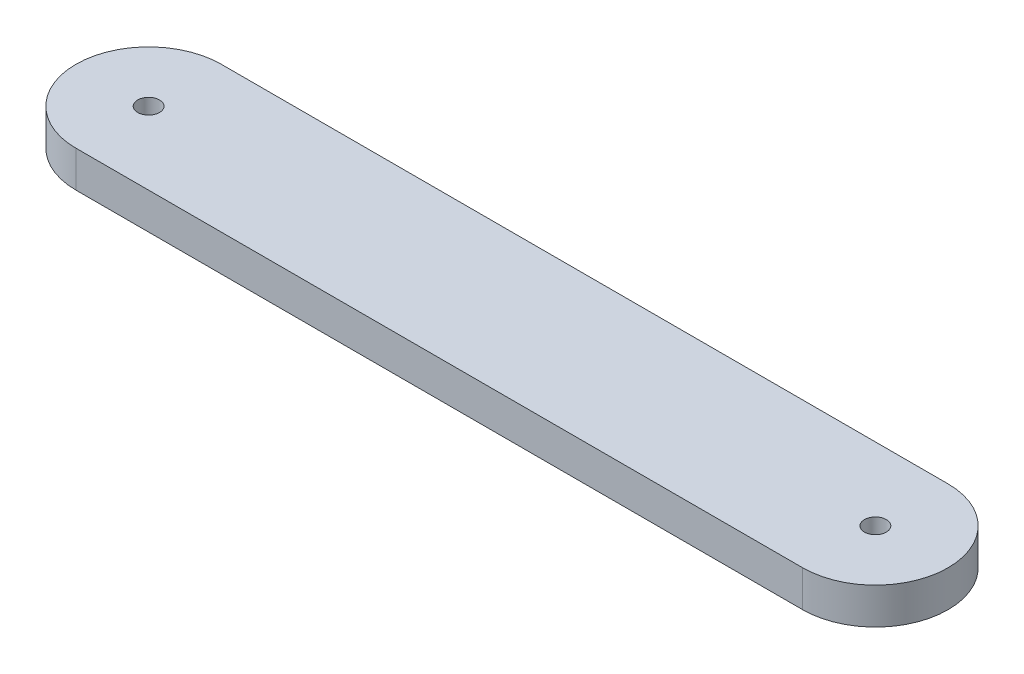
ISO-10303-21;
HEADER;
FILE_DESCRIPTION(('STEP AP214'),'2;1');
FILE_NAME('part.step','',(''),(''),'','','');
FILE_SCHEMA(('AUTOMOTIVE_DESIGN { 1 0 10303 214 1 1 1 1 }'));
ENDSEC;
DATA;
#1=APPLICATION_CONTEXT('core data for automotive mechanical design processes');
#2=APPLICATION_PROTOCOL_DEFINITION('international standard','automotive_design',2000,#1);
#3=PRODUCT_CONTEXT('',#1,'mechanical');
#4=PRODUCT('Part','Part','',(#3));
#5=PRODUCT_RELATED_PRODUCT_CATEGORY('part','',(#4));
#6=PRODUCT_DEFINITION_FORMATION('','',#4);
#7=PRODUCT_DEFINITION_CONTEXT('part definition',#1,'design');
#8=PRODUCT_DEFINITION('design','',#6,#7);
#9=PRODUCT_DEFINITION_SHAPE('','',#8);
#10=(LENGTH_UNIT() NAMED_UNIT(*) SI_UNIT(.MILLI.,.METRE.));
#11=(NAMED_UNIT(*) PLANE_ANGLE_UNIT() SI_UNIT($,.RADIAN.));
#12=(NAMED_UNIT(*) SI_UNIT($,.STERADIAN.) SOLID_ANGLE_UNIT());
#13=UNCERTAINTY_MEASURE_WITH_UNIT(LENGTH_MEASURE(1.E-05),#10,'distance_accuracy_value','');
#14=(GEOMETRIC_REPRESENTATION_CONTEXT(3) GLOBAL_UNCERTAINTY_ASSIGNED_CONTEXT((#13)) GLOBAL_UNIT_ASSIGNED_CONTEXT((#10,
#11,#12)) REPRESENTATION_CONTEXT('',''));
#15=CARTESIAN_POINT('',(0.,0.,0.));
#16=DIRECTION('',(0.,0.,1.));
#17=DIRECTION('',(1.,0.,0.));
#18=AXIS2_PLACEMENT_3D('',#15,#16,#17);
#19=CARTESIAN_POINT('',(-50.,5.,0.));
#20=DIRECTION('',(0.,-1.,0.));
#21=DIRECTION('',(0.,0.,-1.));
#22=AXIS2_PLACEMENT_3D('',#19,#20,#21);
#23=CYLINDRICAL_SURFACE('',#22,10.);
#24=CARTESIAN_POINT('',(-50.,0.,0.));
#25=DIRECTION('',(0.,1.,0.));
#26=DIRECTION('',(0.,0.,1.));
#27=AXIS2_PLACEMENT_3D('',#24,#25,#26);
#28=CIRCLE('',#27,10.);
#29=CARTESIAN_POINT('',(-50.,0.,-10.));
#30=VERTEX_POINT('',#29);
#31=CARTESIAN_POINT('',(-50.,0.,10.));
#32=VERTEX_POINT('',#31);
#33=EDGE_CURVE('E102',#30,#32,#28,.T.);
#34=ORIENTED_EDGE('',*,*,#33,.T.);
#35=DIRECTION('',(0.,-1.,0.));
#36=VECTOR('',#35,1.);
#37=CARTESIAN_POINT('',(-50.,5.,10.));
#38=LINE('',#37,#36);
#39=CARTESIAN_POINT('',(-50.,5.,10.));
#40=VERTEX_POINT('',#39);
#41=EDGE_CURVE('E11',#40,#32,#38,.T.);
#42=ORIENTED_EDGE('',*,*,#41,.F.);
#43=CARTESIAN_POINT('',(-50.,5.,0.));
#44=DIRECTION('',(0.,1.,0.));
#45=DIRECTION('',(0.,0.,1.));
#46=AXIS2_PLACEMENT_3D('',#43,#44,#45);
#47=CIRCLE('',#46,10.);
#48=CARTESIAN_POINT('',(-50.,5.,-10.));
#49=VERTEX_POINT('',#48);
#50=EDGE_CURVE('E90',#49,#40,#47,.T.);
#51=ORIENTED_EDGE('',*,*,#50,.F.);
#52=DIRECTION('',(0.,-1.,0.));
#53=VECTOR('',#52,1.);
#54=CARTESIAN_POINT('',(-50.,5.,-10.));
#55=LINE('',#54,#53);
#56=EDGE_CURVE('E98',#49,#30,#55,.T.);
#57=ORIENTED_EDGE('',*,*,#56,.T.);
#58=EDGE_LOOP('',(#34,#42,#51,#57));
#59=FACE_BOUND('',#58,.T.);
#60=ADVANCED_FACE('F39',(#59),#23,.T.);
#61=CARTESIAN_POINT('',(-50.,5.,10.));
#62=DIRECTION('',(0.,0.,-1.));
#63=DIRECTION('',(-1.,0.,0.));
#64=AXIS2_PLACEMENT_3D('',#61,#62,#63);
#65=PLANE('',#64);
#66=DIRECTION('',(1.,0.,0.));
#67=VECTOR('',#66,1.);
#68=CARTESIAN_POINT('',(-50.,0.,10.));
#69=LINE('',#68,#67);
#70=CARTESIAN_POINT('',(50.,0.,9.99999999999998));
#71=VERTEX_POINT('',#70);
#72=EDGE_CURVE('E94',#32,#71,#69,.T.);
#73=ORIENTED_EDGE('',*,*,#72,.T.);
#74=DIRECTION('',(0.,-1.,0.));
#75=VECTOR('',#74,1.);
#76=CARTESIAN_POINT('',(50.,5.,9.99999999999998));
#77=LINE('',#76,#75);
#78=CARTESIAN_POINT('',(50.,5.,9.99999999999998));
#79=VERTEX_POINT('',#78);
#80=EDGE_CURVE('E47',#79,#71,#77,.T.);
#81=ORIENTED_EDGE('',*,*,#80,.F.);
#82=DIRECTION('',(1.,0.,0.));
#83=VECTOR('',#82,1.);
#84=CARTESIAN_POINT('',(-50.,5.,10.));
#85=LINE('',#84,#83);
#86=EDGE_CURVE('E85',#40,#79,#85,.T.);
#87=ORIENTED_EDGE('',*,*,#86,.F.);
#88=ORIENTED_EDGE('',*,*,#41,.T.);
#89=EDGE_LOOP('',(#73,#81,#87,#88));
#90=FACE_BOUND('',#89,.T.);
#91=ADVANCED_FACE('F93',(#90),#65,.F.);
#92=CARTESIAN_POINT('',(50.,5.,0.));
#93=DIRECTION('',(0.,-1.,0.));
#94=DIRECTION('',(0.,0.,-1.));
#95=AXIS2_PLACEMENT_3D('',#92,#93,#94);
#96=CYLINDRICAL_SURFACE('',#95,10.);
#97=CARTESIAN_POINT('',(50.,0.,0.));
#98=DIRECTION('',(0.,1.,0.));
#99=DIRECTION('',(0.,0.,1.));
#100=AXIS2_PLACEMENT_3D('',#97,#98,#99);
#101=CIRCLE('',#100,10.);
#102=CARTESIAN_POINT('',(50.,0.,-10.));
#103=VERTEX_POINT('',#102);
#104=EDGE_CURVE('E72',#71,#103,#101,.T.);
#105=ORIENTED_EDGE('',*,*,#104,.T.);
#106=DIRECTION('',(0.,-1.,0.));
#107=VECTOR('',#106,1.);
#108=CARTESIAN_POINT('',(50.,5.,-10.));
#109=LINE('',#108,#107);
#110=CARTESIAN_POINT('',(50.,5.,-10.));
#111=VERTEX_POINT('',#110);
#112=EDGE_CURVE('E95',#111,#103,#109,.T.);
#113=ORIENTED_EDGE('',*,*,#112,.F.);
#114=CARTESIAN_POINT('',(50.,5.,0.));
#115=DIRECTION('',(0.,1.,0.));
#116=DIRECTION('',(0.,0.,1.));
#117=AXIS2_PLACEMENT_3D('',#114,#115,#116);
#118=CIRCLE('',#117,10.);
#119=EDGE_CURVE('E88',#79,#111,#118,.T.);
#120=ORIENTED_EDGE('',*,*,#119,.F.);
#121=ORIENTED_EDGE('',*,*,#80,.T.);
#122=EDGE_LOOP('',(#105,#113,#120,#121));
#123=FACE_BOUND('',#122,.T.);
#124=ADVANCED_FACE('F96',(#123),#96,.T.);
#125=CARTESIAN_POINT('',(-50.,5.,-10.));
#126=DIRECTION('',(0.,0.,1.));
#127=DIRECTION('',(1.,0.,0.));
#128=AXIS2_PLACEMENT_3D('',#125,#126,#127);
#129=PLANE('',#128);
#130=DIRECTION('',(-1.,0.,0.));
#131=VECTOR('',#130,1.);
#132=CARTESIAN_POINT('',(-50.,0.,-10.));
#133=LINE('',#132,#131);
#134=EDGE_CURVE('E78',#103,#30,#133,.T.);
#135=ORIENTED_EDGE('',*,*,#134,.T.);
#136=ORIENTED_EDGE('',*,*,#56,.F.);
#137=DIRECTION('',(-1.,0.,0.));
#138=VECTOR('',#137,1.);
#139=CARTESIAN_POINT('',(-50.,5.,-10.));
#140=LINE('',#139,#138);
#141=EDGE_CURVE('E55',#111,#49,#140,.T.);
#142=ORIENTED_EDGE('',*,*,#141,.F.);
#143=ORIENTED_EDGE('',*,*,#112,.T.);
#144=EDGE_LOOP('',(#135,#136,#142,#143));
#145=FACE_BOUND('',#144,.T.);
#146=ADVANCED_FACE('F110',(#145),#129,.F.);
#147=CARTESIAN_POINT('',(-50.,5.,0.));
#148=DIRECTION('',(0.,1.,0.));
#149=DIRECTION('',(0.,0.,1.));
#150=AXIS2_PLACEMENT_3D('',#147,#148,#149);
#151=PLANE('',#150);
#152=CARTESIAN_POINT('',(-50.,5.,0.));
#153=DIRECTION('',(0.,1.,0.));
#154=DIRECTION('',(0.,0.,1.));
#155=AXIS2_PLACEMENT_3D('',#152,#153,#154);
#156=CIRCLE('',#155,1.5);
#157=CARTESIAN_POINT('',(-50.,5.,1.5));
#158=VERTEX_POINT('',#157);
#159=EDGE_CURVE('E119',#158,#158,#156,.T.);
#160=ORIENTED_EDGE('',*,*,#159,.F.);
#161=EDGE_LOOP('',(#160));
#162=FACE_BOUND('',#161,.T.);
#163=CARTESIAN_POINT('',(50.,5.,0.));
#164=DIRECTION('',(0.,1.,0.));
#165=DIRECTION('',(0.,0.,-1.));
#166=AXIS2_PLACEMENT_3D('',#163,#164,#165);
#167=CIRCLE('',#166,1.5);
#168=CARTESIAN_POINT('',(50.,5.,-1.5));
#169=VERTEX_POINT('',#168);
#170=EDGE_CURVE('E116',#169,#169,#167,.T.);
#171=ORIENTED_EDGE('',*,*,#170,.F.);
#172=EDGE_LOOP('',(#171));
#173=FACE_BOUND('',#172,.T.);
#174=ORIENTED_EDGE('',*,*,#50,.T.);
#175=ORIENTED_EDGE('',*,*,#86,.T.);
#176=ORIENTED_EDGE('',*,*,#119,.T.);
#177=ORIENTED_EDGE('',*,*,#141,.T.);
#178=EDGE_LOOP('',(#174,#175,#176,#177));
#179=FACE_BOUND('',#178,.T.);
#180=ADVANCED_FACE('F86',(#162,#173,#179),#151,.T.);
#181=CARTESIAN_POINT('',(-50.,0.,0.));
#182=DIRECTION('',(0.,1.,0.));
#183=DIRECTION('',(0.,0.,1.));
#184=AXIS2_PLACEMENT_3D('',#181,#182,#183);
#185=PLANE('',#184);
#186=CARTESIAN_POINT('',(-50.,0.,0.));
#187=DIRECTION('',(0.,1.,0.));
#188=DIRECTION('',(0.,0.,1.));
#189=AXIS2_PLACEMENT_3D('',#186,#187,#188);
#190=CIRCLE('',#189,1.5);
#191=CARTESIAN_POINT('',(-50.,0.,1.5));
#192=VERTEX_POINT('',#191);
#193=EDGE_CURVE('E105',#192,#192,#190,.F.);
#194=ORIENTED_EDGE('',*,*,#193,.F.);
#195=EDGE_LOOP('',(#194));
#196=FACE_BOUND('',#195,.T.);
#197=CARTESIAN_POINT('',(50.,0.,0.));
#198=DIRECTION('',(0.,1.,0.));
#199=DIRECTION('',(0.,0.,1.));
#200=AXIS2_PLACEMENT_3D('',#197,#198,#199);
#201=CIRCLE('',#200,1.5);
#202=CARTESIAN_POINT('',(50.,0.,1.5));
#203=VERTEX_POINT('',#202);
#204=EDGE_CURVE('E120',#203,#203,#201,.F.);
#205=ORIENTED_EDGE('',*,*,#204,.F.);
#206=EDGE_LOOP('',(#205));
#207=FACE_BOUND('',#206,.T.);
#208=ORIENTED_EDGE('',*,*,#33,.F.);
#209=ORIENTED_EDGE('',*,*,#134,.F.);
#210=ORIENTED_EDGE('',*,*,#104,.F.);
#211=ORIENTED_EDGE('',*,*,#72,.F.);
#212=EDGE_LOOP('',(#208,#209,#210,#211));
#213=FACE_BOUND('',#212,.T.);
#214=ADVANCED_FACE('F113',(#196,#207,#213),#185,.F.);
#215=CARTESIAN_POINT('',(50.,-0.00100000000000013,0.));
#216=DIRECTION('',(0.,1.,0.));
#217=DIRECTION('',(0.,0.,1.));
#218=AXIS2_PLACEMENT_3D('',#215,#216,#217);
#219=CYLINDRICAL_SURFACE('',#218,1.5);
#220=ORIENTED_EDGE('',*,*,#170,.T.);
#221=EDGE_LOOP('',(#220));
#222=FACE_BOUND('',#221,.T.);
#223=ORIENTED_EDGE('',*,*,#204,.T.);
#224=EDGE_LOOP('',(#223));
#225=FACE_BOUND('',#224,.T.);
#226=ADVANCED_FACE('F136',(#222,#225),#219,.F.);
#227=CARTESIAN_POINT('',(-50.,-0.00100000000000013,0.));
#228=DIRECTION('',(0.,1.,0.));
#229=DIRECTION('',(0.,0.,1.));
#230=AXIS2_PLACEMENT_3D('',#227,#228,#229);
#231=CYLINDRICAL_SURFACE('',#230,1.5);
#232=ORIENTED_EDGE('',*,*,#159,.T.);
#233=EDGE_LOOP('',(#232));
#234=FACE_BOUND('',#233,.T.);
#235=ORIENTED_EDGE('',*,*,#193,.T.);
#236=EDGE_LOOP('',(#235));
#237=FACE_BOUND('',#236,.T.);
#238=ADVANCED_FACE('F128',(#234,#237),#231,.F.);
#239=CLOSED_SHELL('',(#60,#91,#124,#146,#180,#214,#226,#238));
#240=MANIFOLD_SOLID_BREP('B2',#239);
#241=ADVANCED_BREP_SHAPE_REPRESENTATION('',(#18,#240),#14);
#242=SHAPE_DEFINITION_REPRESENTATION(#9,#241);
ENDSEC;
END-ISO-10303-21;
